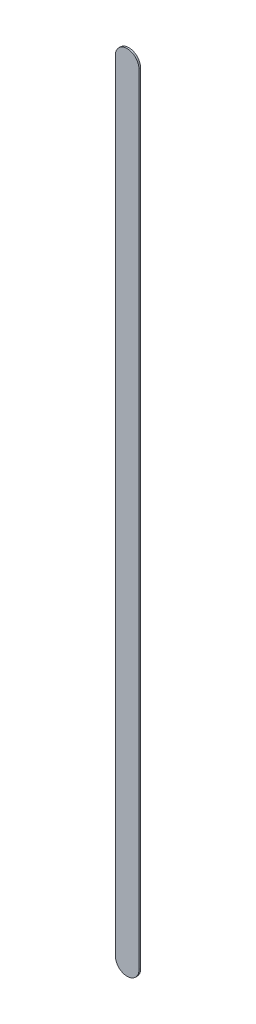
ISO-10303-21;
HEADER;
FILE_DESCRIPTION(('STEP AP214'),'2;1');
FILE_NAME('part.step','',(''),(''),'','','');
FILE_SCHEMA(('AUTOMOTIVE_DESIGN { 1 0 10303 214 1 1 1 1 }'));
ENDSEC;
DATA;
#1=APPLICATION_CONTEXT('core data for automotive mechanical design processes');
#2=APPLICATION_PROTOCOL_DEFINITION('international standard','automotive_design',2000,#1);
#3=PRODUCT_CONTEXT('',#1,'mechanical');
#4=PRODUCT('Part','Part','',(#3));
#5=PRODUCT_RELATED_PRODUCT_CATEGORY('part','',(#4));
#6=PRODUCT_DEFINITION_FORMATION('','',#4);
#7=PRODUCT_DEFINITION_CONTEXT('part definition',#1,'design');
#8=PRODUCT_DEFINITION('design','',#6,#7);
#9=PRODUCT_DEFINITION_SHAPE('','',#8);
#10=(LENGTH_UNIT() NAMED_UNIT(*) SI_UNIT(.MILLI.,.METRE.));
#11=(NAMED_UNIT(*) PLANE_ANGLE_UNIT() SI_UNIT($,.RADIAN.));
#12=(NAMED_UNIT(*) SI_UNIT($,.STERADIAN.) SOLID_ANGLE_UNIT());
#13=UNCERTAINTY_MEASURE_WITH_UNIT(LENGTH_MEASURE(1.E-05),#10,'distance_accuracy_value','');
#14=(GEOMETRIC_REPRESENTATION_CONTEXT(3) GLOBAL_UNCERTAINTY_ASSIGNED_CONTEXT((#13)) GLOBAL_UNIT_ASSIGNED_CONTEXT((#10,
#11,#12)) REPRESENTATION_CONTEXT('',''));
#15=CARTESIAN_POINT('',(0.,0.,0.));
#16=DIRECTION('',(0.,0.,1.));
#17=DIRECTION('',(1.,0.,0.));
#18=AXIS2_PLACEMENT_3D('',#15,#16,#17);
#19=CARTESIAN_POINT('',(77.15000064,76.50000194,0.));
#20=DIRECTION('',(-1.,0.,0.));
#21=DIRECTION('',(0.,1.,0.));
#22=AXIS2_PLACEMENT_3D('',#19,#20,#21);
#23=PLANE('',#22);
#24=DIRECTION('',(0.,1.,0.));
#25=VECTOR('',#24,1.);
#26=CARTESIAN_POINT('',(77.15000064,76.50000194,0.03556));
#27=LINE('',#26,#25);
#28=CARTESIAN_POINT('',(77.15000064,76.50000194,0.03556));
#29=VERTEX_POINT('',#28);
#30=CARTESIAN_POINT('',(77.15000064,92.99999942,0.03556));
#31=VERTEX_POINT('',#30);
#32=EDGE_CURVE('E11',#29,#31,#27,.T.);
#33=ORIENTED_EDGE('',*,*,#32,.F.);
#34=DIRECTION('',(0.,0.,1.));
#35=VECTOR('',#34,1.);
#36=CARTESIAN_POINT('',(77.15000064,76.50000194,0.));
#37=LINE('',#36,#35);
#38=CARTESIAN_POINT('',(77.15000064,76.50000194,0.));
#39=VERTEX_POINT('',#38);
#40=EDGE_CURVE('E24',#39,#29,#37,.T.);
#41=ORIENTED_EDGE('',*,*,#40,.F.);
#42=DIRECTION('',(0.,1.,0.));
#43=VECTOR('',#42,1.);
#44=CARTESIAN_POINT('',(77.15000064,76.50000194,0.));
#45=LINE('',#44,#43);
#46=CARTESIAN_POINT('',(77.15000064,92.99999942,0.));
#47=VERTEX_POINT('',#46);
#48=EDGE_CURVE('E75',#39,#47,#45,.T.);
#49=ORIENTED_EDGE('',*,*,#48,.T.);
#50=DIRECTION('',(0.,0.,1.));
#51=VECTOR('',#50,1.);
#52=CARTESIAN_POINT('',(77.15000064,92.99999942,0.));
#53=LINE('',#52,#51);
#54=EDGE_CURVE('E37',#47,#31,#53,.T.);
#55=ORIENTED_EDGE('',*,*,#54,.T.);
#56=EDGE_LOOP('',(#33,#41,#49,#55));
#57=FACE_BOUND('',#56,.T.);
#58=ADVANCED_FACE('F17',(#57),#23,.F.);
#59=CARTESIAN_POINT('',(76.90000114,92.99999942,0.));
#60=DIRECTION('',(0.,0.,-1.));
#61=DIRECTION('',(1.,0.,0.));
#62=AXIS2_PLACEMENT_3D('',#59,#60,#61);
#63=CYLINDRICAL_SURFACE('',#62,0.249999500000001);
#64=CARTESIAN_POINT('',(76.90000114,92.99999942,0.03556));
#65=DIRECTION('',(0.,0.,1.));
#66=DIRECTION('',(1.,0.,0.));
#67=AXIS2_PLACEMENT_3D('',#64,#65,#66);
#68=CIRCLE('',#67,0.249999500000001);
#69=CARTESIAN_POINT('',(76.65000164,92.99999942,0.03556));
#70=VERTEX_POINT('',#69);
#71=EDGE_CURVE('E83',#31,#70,#68,.T.);
#72=ORIENTED_EDGE('',*,*,#71,.F.);
#73=ORIENTED_EDGE('',*,*,#54,.F.);
#74=CARTESIAN_POINT('',(76.90000114,92.99999942,0.));
#75=DIRECTION('',(0.,0.,1.));
#76=DIRECTION('',(1.,0.,0.));
#77=AXIS2_PLACEMENT_3D('',#74,#75,#76);
#78=CIRCLE('',#77,0.249999500000001);
#79=CARTESIAN_POINT('',(76.65000164,92.99999942,0.));
#80=VERTEX_POINT('',#79);
#81=EDGE_CURVE('E81',#47,#80,#78,.T.);
#82=ORIENTED_EDGE('',*,*,#81,.T.);
#83=DIRECTION('',(0.,0.,1.));
#84=VECTOR('',#83,1.);
#85=CARTESIAN_POINT('',(76.65000164,92.99999942,0.));
#86=LINE('',#85,#84);
#87=EDGE_CURVE('E67',#80,#70,#86,.T.);
#88=ORIENTED_EDGE('',*,*,#87,.T.);
#89=EDGE_LOOP('',(#72,#73,#82,#88));
#90=FACE_BOUND('',#89,.T.);
#91=ADVANCED_FACE('F89',(#90),#63,.T.);
#92=CARTESIAN_POINT('',(76.65000164,92.99999942,0.));
#93=DIRECTION('',(1.,0.,0.));
#94=DIRECTION('',(0.,-1.,0.));
#95=AXIS2_PLACEMENT_3D('',#92,#93,#94);
#96=PLANE('',#95);
#97=DIRECTION('',(0.,-1.,0.));
#98=VECTOR('',#97,1.);
#99=CARTESIAN_POINT('',(76.65000164,92.99999942,0.03556));
#100=LINE('',#99,#98);
#101=CARTESIAN_POINT('',(76.65000164,76.50000194,0.03556));
#102=VERTEX_POINT('',#101);
#103=EDGE_CURVE('E71',#70,#102,#100,.T.);
#104=ORIENTED_EDGE('',*,*,#103,.F.);
#105=ORIENTED_EDGE('',*,*,#87,.F.);
#106=DIRECTION('',(0.,-1.,0.));
#107=VECTOR('',#106,1.);
#108=CARTESIAN_POINT('',(76.65000164,92.99999942,0.));
#109=LINE('',#108,#107);
#110=CARTESIAN_POINT('',(76.65000164,76.50000194,0.));
#111=VERTEX_POINT('',#110);
#112=EDGE_CURVE('E63',#80,#111,#109,.T.);
#113=ORIENTED_EDGE('',*,*,#112,.T.);
#114=DIRECTION('',(0.,0.,1.));
#115=VECTOR('',#114,1.);
#116=CARTESIAN_POINT('',(76.65000164,76.50000194,0.));
#117=LINE('',#116,#115);
#118=EDGE_CURVE('E53',#111,#102,#117,.T.);
#119=ORIENTED_EDGE('',*,*,#118,.T.);
#120=EDGE_LOOP('',(#104,#105,#113,#119));
#121=FACE_BOUND('',#120,.T.);
#122=ADVANCED_FACE('F66',(#121),#96,.F.);
#123=CARTESIAN_POINT('',(76.90000114,76.50000194,0.));
#124=DIRECTION('',(0.,0.,-1.));
#125=DIRECTION('',(-1.,0.,0.));
#126=AXIS2_PLACEMENT_3D('',#123,#124,#125);
#127=CYLINDRICAL_SURFACE('',#126,0.249999500000001);
#128=CARTESIAN_POINT('',(76.90000114,76.50000194,0.03556));
#129=DIRECTION('',(0.,0.,1.));
#130=DIRECTION('',(-1.,0.,0.));
#131=AXIS2_PLACEMENT_3D('',#128,#129,#130);
#132=CIRCLE('',#131,0.249999500000001);
#133=EDGE_CURVE('E59',#102,#29,#132,.T.);
#134=ORIENTED_EDGE('',*,*,#133,.F.);
#135=ORIENTED_EDGE('',*,*,#118,.F.);
#136=CARTESIAN_POINT('',(76.90000114,76.50000194,0.));
#137=DIRECTION('',(0.,0.,1.));
#138=DIRECTION('',(-1.,0.,0.));
#139=AXIS2_PLACEMENT_3D('',#136,#137,#138);
#140=CIRCLE('',#139,0.249999500000001);
#141=EDGE_CURVE('E57',#111,#39,#140,.T.);
#142=ORIENTED_EDGE('',*,*,#141,.T.);
#143=ORIENTED_EDGE('',*,*,#40,.T.);
#144=EDGE_LOOP('',(#134,#135,#142,#143));
#145=FACE_BOUND('',#144,.T.);
#146=ADVANCED_FACE('F55',(#145),#127,.T.);
#147=CARTESIAN_POINT('',(77.15000064,76.50000194,0.));
#148=DIRECTION('',(0.,0.,-1.));
#149=DIRECTION('',(-1.,0.,0.));
#150=AXIS2_PLACEMENT_3D('',#147,#148,#149);
#151=PLANE('',#150);
#152=ORIENTED_EDGE('',*,*,#141,.F.);
#153=ORIENTED_EDGE('',*,*,#112,.F.);
#154=ORIENTED_EDGE('',*,*,#81,.F.);
#155=ORIENTED_EDGE('',*,*,#48,.F.);
#156=EDGE_LOOP('',(#152,#153,#154,#155));
#157=FACE_BOUND('',#156,.T.);
#158=ADVANCED_FACE('F74',(#157),#151,.T.);
#159=CARTESIAN_POINT('',(77.15000064,76.50000194,0.03556));
#160=DIRECTION('',(0.,0.,-1.));
#161=DIRECTION('',(-1.,0.,0.));
#162=AXIS2_PLACEMENT_3D('',#159,#160,#161);
#163=PLANE('',#162);
#164=ORIENTED_EDGE('',*,*,#32,.T.);
#165=ORIENTED_EDGE('',*,*,#71,.T.);
#166=ORIENTED_EDGE('',*,*,#103,.T.);
#167=ORIENTED_EDGE('',*,*,#133,.T.);
#168=EDGE_LOOP('',(#164,#165,#166,#167));
#169=FACE_BOUND('',#168,.T.);
#170=ADVANCED_FACE('F91',(#169),#163,.F.);
#171=CLOSED_SHELL('',(#58,#91,#122,#146,#158,#170));
#172=MANIFOLD_SOLID_BREP('B1',#171);
#173=ADVANCED_BREP_SHAPE_REPRESENTATION('',(#18,#172),#14);
#174=SHAPE_DEFINITION_REPRESENTATION(#9,#173);
ENDSEC;
END-ISO-10303-21;
